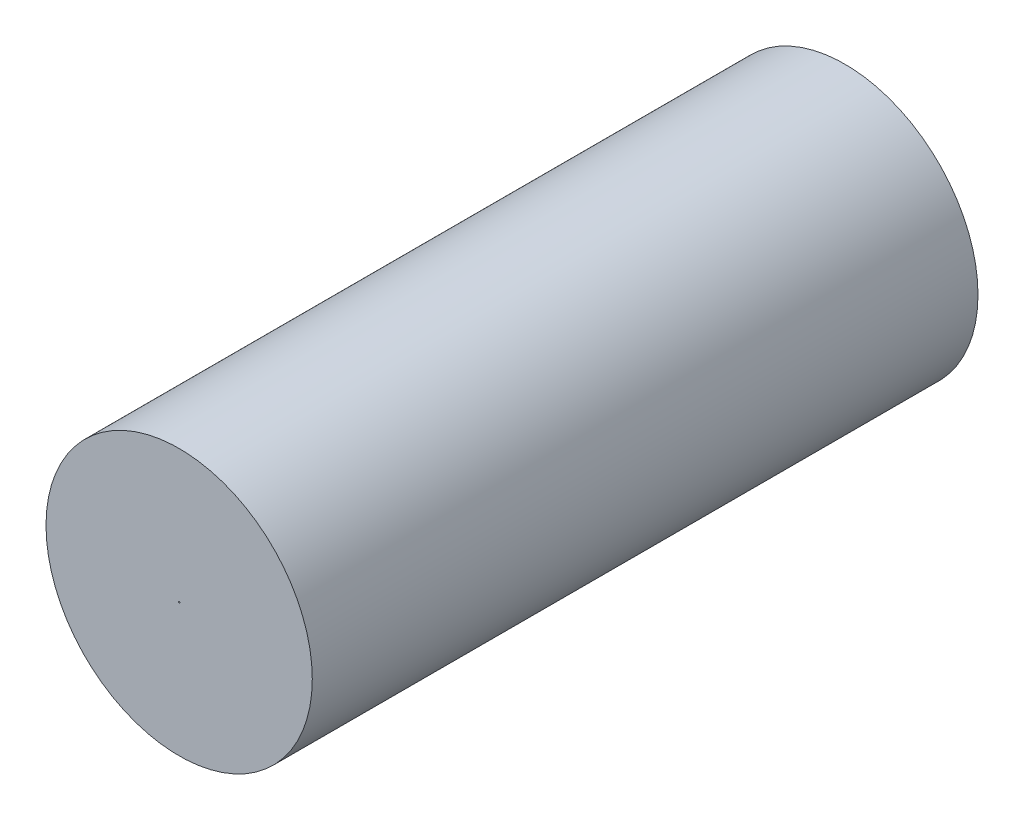
ISO-10303-21;
HEADER;
FILE_DESCRIPTION(('STEP AP214'),'2;1');
FILE_NAME('part.step','',(''),(''),'','','');
FILE_SCHEMA(('AUTOMOTIVE_DESIGN { 1 0 10303 214 1 1 1 1 }'));
ENDSEC;
DATA;
#1=APPLICATION_CONTEXT('core data for automotive mechanical design processes');
#2=APPLICATION_PROTOCOL_DEFINITION('international standard','automotive_design',2000,#1);
#3=PRODUCT_CONTEXT('',#1,'mechanical');
#4=PRODUCT('Part','Part','',(#3));
#5=PRODUCT_RELATED_PRODUCT_CATEGORY('part','',(#4));
#6=PRODUCT_DEFINITION_FORMATION('','',#4);
#7=PRODUCT_DEFINITION_CONTEXT('part definition',#1,'design');
#8=PRODUCT_DEFINITION('design','',#6,#7);
#9=PRODUCT_DEFINITION_SHAPE('','',#8);
#10=(LENGTH_UNIT() NAMED_UNIT(*) SI_UNIT(.MILLI.,.METRE.));
#11=(NAMED_UNIT(*) PLANE_ANGLE_UNIT() SI_UNIT($,.RADIAN.));
#12=(NAMED_UNIT(*) SI_UNIT($,.STERADIAN.) SOLID_ANGLE_UNIT());
#13=UNCERTAINTY_MEASURE_WITH_UNIT(LENGTH_MEASURE(1.E-05),#10,'distance_accuracy_value','');
#14=(GEOMETRIC_REPRESENTATION_CONTEXT(3) GLOBAL_UNCERTAINTY_ASSIGNED_CONTEXT((#13)) GLOBAL_UNIT_ASSIGNED_CONTEXT((#10,
#11,#12)) REPRESENTATION_CONTEXT('',''));
#15=CARTESIAN_POINT('',(0.,0.,0.));
#16=DIRECTION('',(0.,0.,1.));
#17=DIRECTION('',(1.,0.,0.));
#18=AXIS2_PLACEMENT_3D('',#15,#16,#17);
#19=CARTESIAN_POINT('',(0.,0.,-1.));
#20=DIRECTION('',(0.,0.,-1.));
#21=DIRECTION('',(1.,0.,0.));
#22=AXIS2_PLACEMENT_3D('',#19,#20,#21);
#23=CYLINDRICAL_SURFACE('',#22,0.01);
#24=CARTESIAN_POINT('',(0.,0.,0.));
#25=DIRECTION('',(0.,0.,-1.));
#26=DIRECTION('',(1.,0.,0.));
#27=AXIS2_PLACEMENT_3D('',#24,#25,#26);
#28=CIRCLE('',#27,0.01);
#29=CARTESIAN_POINT('',(0.01,0.,0.));
#30=VERTEX_POINT('',#29);
#31=EDGE_CURVE('E61',#30,#30,#28,.T.);
#32=ORIENTED_EDGE('',*,*,#31,.T.);
#33=DIRECTION('',(0.,0.,1.));
#34=VECTOR('',#33,1.);
#35=CARTESIAN_POINT('',(0.01,0.,-1.));
#36=LINE('',#35,#34);
#37=CARTESIAN_POINT('',(0.01,0.,10.));
#38=VERTEX_POINT('',#37);
#39=EDGE_CURVE('E9',#30,#38,#36,.T.);
#40=ORIENTED_EDGE('',*,*,#39,.T.);
#41=CARTESIAN_POINT('',(0.,0.,10.));
#42=DIRECTION('',(0.,0.,-1.));
#43=DIRECTION('',(1.,0.,0.));
#44=AXIS2_PLACEMENT_3D('',#41,#42,#43);
#45=CIRCLE('',#44,0.01);
#46=EDGE_CURVE('E24',#38,#38,#45,.T.);
#47=ORIENTED_EDGE('',*,*,#46,.F.);
#48=ORIENTED_EDGE('',*,*,#39,.F.);
#49=EDGE_LOOP('',(#32,#40,#47,#48));
#50=FACE_BOUND('',#49,.T.);
#51=ADVANCED_FACE('F15',(#50),#23,.F.);
#52=CARTESIAN_POINT('',(0.,0.,10.));
#53=DIRECTION('',(0.,0.,1.));
#54=DIRECTION('',(1.,0.,0.));
#55=AXIS2_PLACEMENT_3D('',#52,#53,#54);
#56=PLANE('',#55);
#57=ORIENTED_EDGE('',*,*,#46,.T.);
#58=EDGE_LOOP('',(#57));
#59=FACE_BOUND('',#58,.T.);
#60=CARTESIAN_POINT('',(0.,0.,10.));
#61=DIRECTION('',(0.,0.,1.));
#62=DIRECTION('',(1.,0.,0.));
#63=AXIS2_PLACEMENT_3D('',#60,#61,#62);
#64=CIRCLE('',#63,2.);
#65=CARTESIAN_POINT('',(2.,0.,10.));
#66=VERTEX_POINT('',#65);
#67=EDGE_CURVE('E54',#66,#66,#64,.T.);
#68=ORIENTED_EDGE('',*,*,#67,.T.);
#69=EDGE_LOOP('',(#68));
#70=FACE_BOUND('',#69,.T.);
#71=ADVANCED_FACE('F17',(#59,#70),#56,.T.);
#72=CARTESIAN_POINT('',(0.,0.,0.));
#73=DIRECTION('',(0.,0.,1.));
#74=DIRECTION('',(1.,0.,0.));
#75=AXIS2_PLACEMENT_3D('',#72,#73,#74);
#76=PLANE('',#75);
#77=ORIENTED_EDGE('',*,*,#31,.F.);
#78=EDGE_LOOP('',(#77));
#79=FACE_BOUND('',#78,.T.);
#80=CARTESIAN_POINT('',(0.,0.,0.));
#81=DIRECTION('',(0.,0.,1.));
#82=DIRECTION('',(1.,0.,0.));
#83=AXIS2_PLACEMENT_3D('',#80,#81,#82);
#84=CIRCLE('',#83,2.);
#85=CARTESIAN_POINT('',(2.,0.,0.));
#86=VERTEX_POINT('',#85);
#87=EDGE_CURVE('E53',#86,#86,#84,.T.);
#88=ORIENTED_EDGE('',*,*,#87,.F.);
#89=EDGE_LOOP('',(#88));
#90=FACE_BOUND('',#89,.T.);
#91=ADVANCED_FACE('F80',(#79,#90),#76,.F.);
#92=CARTESIAN_POINT('',(0.,0.,0.));
#93=DIRECTION('',(0.,0.,-1.));
#94=DIRECTION('',(1.,0.,0.));
#95=AXIS2_PLACEMENT_3D('',#92,#93,#94);
#96=CYLINDRICAL_SURFACE('',#95,2.);
#97=ORIENTED_EDGE('',*,*,#87,.T.);
#98=DIRECTION('',(0.,0.,1.));
#99=VECTOR('',#98,1.);
#100=CARTESIAN_POINT('',(2.,0.,0.));
#101=LINE('',#100,#99);
#102=EDGE_CURVE('E51',#86,#66,#101,.T.);
#103=ORIENTED_EDGE('',*,*,#102,.T.);
#104=ORIENTED_EDGE('',*,*,#67,.F.);
#105=ORIENTED_EDGE('',*,*,#102,.F.);
#106=EDGE_LOOP('',(#97,#103,#104,#105));
#107=FACE_BOUND('',#106,.T.);
#108=ADVANCED_FACE('F55',(#107),#96,.T.);
#109=CLOSED_SHELL('',(#51,#71,#91,#108));
#110=MANIFOLD_SOLID_BREP('B1',#109);
#111=ADVANCED_BREP_SHAPE_REPRESENTATION('',(#18,#110),#14);
#112=SHAPE_DEFINITION_REPRESENTATION(#9,#111);
ENDSEC;
END-ISO-10303-21;
